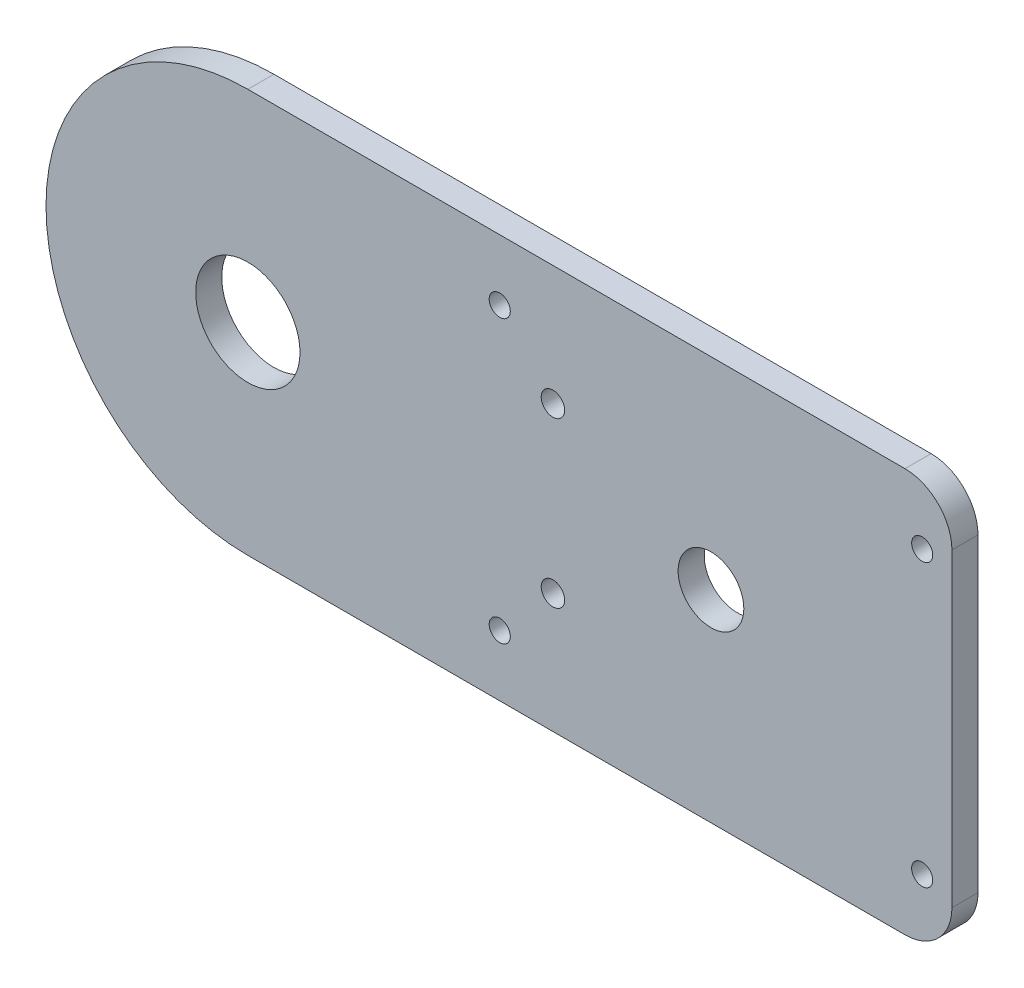
ISO-10303-21;
HEADER;
FILE_DESCRIPTION(('STEP AP214'),'2;1');
FILE_NAME('part.step','',(''),(''),'','','');
FILE_SCHEMA(('AUTOMOTIVE_DESIGN { 1 0 10303 214 1 1 1 1 }'));
ENDSEC;
DATA;
#1=APPLICATION_CONTEXT('core data for automotive mechanical design processes');
#2=APPLICATION_PROTOCOL_DEFINITION('international standard','automotive_design',2000,#1);
#3=PRODUCT_CONTEXT('',#1,'mechanical');
#4=PRODUCT('Part','Part','',(#3));
#5=PRODUCT_RELATED_PRODUCT_CATEGORY('part','',(#4));
#6=PRODUCT_DEFINITION_FORMATION('','',#4);
#7=PRODUCT_DEFINITION_CONTEXT('part definition',#1,'design');
#8=PRODUCT_DEFINITION('design','',#6,#7);
#9=PRODUCT_DEFINITION_SHAPE('','',#8);
#10=(LENGTH_UNIT() NAMED_UNIT(*) SI_UNIT(.MILLI.,.METRE.));
#11=(NAMED_UNIT(*) PLANE_ANGLE_UNIT() SI_UNIT($,.RADIAN.));
#12=(NAMED_UNIT(*) SI_UNIT($,.STERADIAN.) SOLID_ANGLE_UNIT());
#13=UNCERTAINTY_MEASURE_WITH_UNIT(LENGTH_MEASURE(1.E-05),#10,'distance_accuracy_value','');
#14=(GEOMETRIC_REPRESENTATION_CONTEXT(3) GLOBAL_UNCERTAINTY_ASSIGNED_CONTEXT((#13)) GLOBAL_UNIT_ASSIGNED_CONTEXT((#10,
#11,#12)) REPRESENTATION_CONTEXT('',''));
#15=CARTESIAN_POINT('',(0.,0.,0.));
#16=DIRECTION('',(0.,0.,1.));
#17=DIRECTION('',(1.,0.,0.));
#18=AXIS2_PLACEMENT_3D('',#15,#16,#17);
#19=CARTESIAN_POINT('',(-65.,0.,5.55625));
#20=DIRECTION('',(0.,0.,1.));
#21=DIRECTION('',(1.,0.,0.));
#22=AXIS2_PLACEMENT_3D('',#19,#20,#21);
#23=PLANE('',#22);
#24=CARTESIAN_POINT('',(0.,17.5,5.55625));
#25=DIRECTION('',(0.,0.,1.));
#26=DIRECTION('',(1.,0.,0.));
#27=AXIS2_PLACEMENT_3D('',#24,#25,#26);
#28=CIRCLE('',#27,2.5);
#29=CARTESIAN_POINT('',(2.49999999999999,17.5,5.55625));
#30=VERTEX_POINT('',#29);
#31=EDGE_CURVE('E144',#30,#30,#28,.T.);
#32=ORIENTED_EDGE('',*,*,#31,.F.);
#33=EDGE_LOOP('',(#32));
#34=FACE_BOUND('',#33,.T.);
#35=CARTESIAN_POINT('',(0.,-17.5,5.55625));
#36=DIRECTION('',(0.,0.,1.));
#37=DIRECTION('',(1.,0.,0.));
#38=AXIS2_PLACEMENT_3D('',#35,#36,#37);
#39=CIRCLE('',#38,2.5);
#40=CARTESIAN_POINT('',(2.5,-17.5,5.55625));
#41=VERTEX_POINT('',#40);
#42=EDGE_CURVE('E150',#41,#41,#39,.T.);
#43=ORIENTED_EDGE('',*,*,#42,.F.);
#44=EDGE_LOOP('',(#43));
#45=FACE_BOUND('',#44,.T.);
#46=CARTESIAN_POINT('',(78.66639768,-30.,5.55625));
#47=DIRECTION('',(0.,0.,1.));
#48=DIRECTION('',(1.,0.,0.));
#49=AXIS2_PLACEMENT_3D('',#46,#47,#48);
#50=CIRCLE('',#49,2.25000000101589);
#51=CARTESIAN_POINT('',(80.9163976810159,-30.,5.55625));
#52=VERTEX_POINT('',#51);
#53=EDGE_CURVE('E160',#52,#52,#50,.T.);
#54=ORIENTED_EDGE('',*,*,#53,.F.);
#55=EDGE_LOOP('',(#54));
#56=FACE_BOUND('',#55,.T.);
#57=CARTESIAN_POINT('',(-11.33360232,30.,5.55625));
#58=DIRECTION('',(0.,0.,1.));
#59=DIRECTION('',(1.,0.,0.));
#60=AXIS2_PLACEMENT_3D('',#57,#58,#59);
#61=CIRCLE('',#60,2.25000000101589);
#62=CARTESIAN_POINT('',(-9.0836023189841,30.,5.55625));
#63=VERTEX_POINT('',#62);
#64=EDGE_CURVE('E159',#63,#63,#61,.T.);
#65=ORIENTED_EDGE('',*,*,#64,.F.);
#66=EDGE_LOOP('',(#65));
#67=FACE_BOUND('',#66,.T.);
#68=CARTESIAN_POINT('',(-11.33360232,-30.,5.55625));
#69=DIRECTION('',(0.,0.,1.));
#70=DIRECTION('',(1.,0.,0.));
#71=AXIS2_PLACEMENT_3D('',#68,#69,#70);
#72=CIRCLE('',#71,2.25000000101589);
#73=CARTESIAN_POINT('',(-9.0836023189841,-30.,5.55625));
#74=VERTEX_POINT('',#73);
#75=EDGE_CURVE('E148',#74,#74,#72,.T.);
#76=ORIENTED_EDGE('',*,*,#75,.F.);
#77=EDGE_LOOP('',(#76));
#78=FACE_BOUND('',#77,.T.);
#79=CARTESIAN_POINT('',(78.66639768,30.,5.55625));
#80=DIRECTION('',(0.,0.,1.));
#81=DIRECTION('',(1.,0.,0.));
#82=AXIS2_PLACEMENT_3D('',#79,#80,#81);
#83=CIRCLE('',#82,2.25000000101589);
#84=CARTESIAN_POINT('',(80.9163976810159,30.,5.55625));
#85=VERTEX_POINT('',#84);
#86=EDGE_CURVE('E133',#85,#85,#83,.T.);
#87=ORIENTED_EDGE('',*,*,#86,.F.);
#88=EDGE_LOOP('',(#87));
#89=FACE_BOUND('',#88,.T.);
#90=CARTESIAN_POINT('',(33.66639768,0.,5.55625));
#91=DIRECTION('',(0.,0.,1.));
#92=DIRECTION('',(1.,0.,0.));
#93=AXIS2_PLACEMENT_3D('',#90,#91,#92);
#94=CIRCLE('',#93,7.00000000101591);
#95=CARTESIAN_POINT('',(40.6663976810159,0.,5.55625));
#96=VERTEX_POINT('',#95);
#97=EDGE_CURVE('E141',#96,#96,#94,.T.);
#98=ORIENTED_EDGE('',*,*,#97,.F.);
#99=EDGE_LOOP('',(#98));
#100=FACE_BOUND('',#99,.T.);
#101=DIRECTION('',(1.,0.,0.));
#102=VECTOR('',#101,1.);
#103=CARTESIAN_POINT('',(85.,-43.,5.55625));
#104=LINE('',#103,#102);
#105=CARTESIAN_POINT('',(-65.,-43.,5.55625));
#106=VERTEX_POINT('',#105);
#107=CARTESIAN_POINT('',(75.,-43.,5.55625));
#108=VERTEX_POINT('',#107);
#109=EDGE_CURVE('E91',#106,#108,#104,.T.);
#110=ORIENTED_EDGE('',*,*,#109,.T.);
#111=CARTESIAN_POINT('',(75.,-33.,5.55625));
#112=DIRECTION('',(0.,0.,1.));
#113=DIRECTION('',(1.,0.,0.));
#114=AXIS2_PLACEMENT_3D('',#111,#112,#113);
#115=CIRCLE('',#114,10.);
#116=CARTESIAN_POINT('',(85.,-33.,5.55625));
#117=VERTEX_POINT('',#116);
#118=EDGE_CURVE('E45',#108,#117,#115,.T.);
#119=ORIENTED_EDGE('',*,*,#118,.T.);
#120=DIRECTION('',(0.,1.,0.));
#121=VECTOR('',#120,1.);
#122=CARTESIAN_POINT('',(85.,43.,5.55625));
#123=LINE('',#122,#121);
#124=CARTESIAN_POINT('',(85.,33.,5.55625));
#125=VERTEX_POINT('',#124);
#126=EDGE_CURVE('E98',#117,#125,#123,.T.);
#127=ORIENTED_EDGE('',*,*,#126,.T.);
#128=CARTESIAN_POINT('',(75.,33.,5.55625));
#129=DIRECTION('',(0.,0.,1.));
#130=DIRECTION('',(1.,0.,0.));
#131=AXIS2_PLACEMENT_3D('',#128,#129,#130);
#132=CIRCLE('',#131,10.);
#133=CARTESIAN_POINT('',(75.,43.,5.55625));
#134=VERTEX_POINT('',#133);
#135=EDGE_CURVE('E53',#125,#134,#132,.T.);
#136=ORIENTED_EDGE('',*,*,#135,.T.);
#137=DIRECTION('',(-1.,0.,0.));
#138=VECTOR('',#137,1.);
#139=CARTESIAN_POINT('',(-65.,43.,5.55625));
#140=LINE('',#139,#138);
#141=CARTESIAN_POINT('',(-65.,43.,5.55625));
#142=VERTEX_POINT('',#141);
#143=EDGE_CURVE('E103',#134,#142,#140,.T.);
#144=ORIENTED_EDGE('',*,*,#143,.T.);
#145=CARTESIAN_POINT('',(-65.,0.,5.55625));
#146=DIRECTION('',(0.,0.,1.));
#147=DIRECTION('',(1.,0.,0.));
#148=AXIS2_PLACEMENT_3D('',#145,#146,#147);
#149=CIRCLE('',#148,43.);
#150=EDGE_CURVE('E99',#142,#106,#149,.T.);
#151=ORIENTED_EDGE('',*,*,#150,.T.);
#152=EDGE_LOOP('',(#110,#119,#127,#136,#144,#151));
#153=FACE_BOUND('',#152,.T.);
#154=CARTESIAN_POINT('',(-65.,0.,5.55625));
#155=DIRECTION('',(0.,0.,1.));
#156=DIRECTION('',(1.,0.,0.));
#157=AXIS2_PLACEMENT_3D('',#154,#155,#156);
#158=CIRCLE('',#157,11.1125);
#159=CARTESIAN_POINT('',(-53.8875,0.,5.55625));
#160=VERTEX_POINT('',#159);
#161=EDGE_CURVE('E173',#160,#160,#158,.T.);
#162=ORIENTED_EDGE('',*,*,#161,.F.);
#163=EDGE_LOOP('',(#162));
#164=FACE_BOUND('',#163,.T.);
#165=ADVANCED_FACE('F36',(#34,#45,#56,#67,#78,#89,#100,#153,#164),#23,.T.);
#166=CARTESIAN_POINT('',(-65.,0.,0.));
#167=DIRECTION('',(0.,0.,1.));
#168=DIRECTION('',(1.,0.,0.));
#169=AXIS2_PLACEMENT_3D('',#166,#167,#168);
#170=PLANE('',#169);
#171=CARTESIAN_POINT('',(0.,17.5,0.));
#172=DIRECTION('',(0.,0.,1.));
#173=DIRECTION('',(1.,0.,0.));
#174=AXIS2_PLACEMENT_3D('',#171,#172,#173);
#175=CIRCLE('',#174,2.5);
#176=CARTESIAN_POINT('',(2.49999999999999,17.5,0.));
#177=VERTEX_POINT('',#176);
#178=EDGE_CURVE('E40',#177,#177,#175,.T.);
#179=ORIENTED_EDGE('',*,*,#178,.T.);
#180=EDGE_LOOP('',(#179));
#181=FACE_BOUND('',#180,.T.);
#182=CARTESIAN_POINT('',(0.,-17.5,0.));
#183=DIRECTION('',(0.,0.,1.));
#184=DIRECTION('',(1.,0.,0.));
#185=AXIS2_PLACEMENT_3D('',#182,#183,#184);
#186=CIRCLE('',#185,2.5);
#187=CARTESIAN_POINT('',(2.5,-17.5,0.));
#188=VERTEX_POINT('',#187);
#189=EDGE_CURVE('E142',#188,#188,#186,.T.);
#190=ORIENTED_EDGE('',*,*,#189,.T.);
#191=EDGE_LOOP('',(#190));
#192=FACE_BOUND('',#191,.T.);
#193=CARTESIAN_POINT('',(78.66639768,-30.,0.));
#194=DIRECTION('',(0.,0.,1.));
#195=DIRECTION('',(1.,0.,0.));
#196=AXIS2_PLACEMENT_3D('',#193,#194,#195);
#197=CIRCLE('',#196,2.25000000101589);
#198=CARTESIAN_POINT('',(80.9163976810159,-30.,0.));
#199=VERTEX_POINT('',#198);
#200=EDGE_CURVE('E139',#199,#199,#197,.T.);
#201=ORIENTED_EDGE('',*,*,#200,.T.);
#202=EDGE_LOOP('',(#201));
#203=FACE_BOUND('',#202,.T.);
#204=CARTESIAN_POINT('',(-11.33360232,30.,0.));
#205=DIRECTION('',(0.,0.,1.));
#206=DIRECTION('',(1.,0.,0.));
#207=AXIS2_PLACEMENT_3D('',#204,#205,#206);
#208=CIRCLE('',#207,2.25000000101589);
#209=CARTESIAN_POINT('',(-9.0836023189841,30.,0.));
#210=VERTEX_POINT('',#209);
#211=EDGE_CURVE('E136',#210,#210,#208,.T.);
#212=ORIENTED_EDGE('',*,*,#211,.T.);
#213=EDGE_LOOP('',(#212));
#214=FACE_BOUND('',#213,.T.);
#215=CARTESIAN_POINT('',(-11.33360232,-30.,0.));
#216=DIRECTION('',(0.,0.,1.));
#217=DIRECTION('',(1.,0.,0.));
#218=AXIS2_PLACEMENT_3D('',#215,#216,#217);
#219=CIRCLE('',#218,2.25000000101589);
#220=CARTESIAN_POINT('',(-9.0836023189841,-30.,0.));
#221=VERTEX_POINT('',#220);
#222=EDGE_CURVE('E132',#221,#221,#219,.T.);
#223=ORIENTED_EDGE('',*,*,#222,.T.);
#224=EDGE_LOOP('',(#223));
#225=FACE_BOUND('',#224,.T.);
#226=CARTESIAN_POINT('',(78.66639768,30.,0.));
#227=DIRECTION('',(0.,0.,1.));
#228=DIRECTION('',(1.,0.,0.));
#229=AXIS2_PLACEMENT_3D('',#226,#227,#228);
#230=CIRCLE('',#229,2.25000000101589);
#231=CARTESIAN_POINT('',(80.9163976810159,30.,0.));
#232=VERTEX_POINT('',#231);
#233=EDGE_CURVE('E129',#232,#232,#230,.T.);
#234=ORIENTED_EDGE('',*,*,#233,.T.);
#235=EDGE_LOOP('',(#234));
#236=FACE_BOUND('',#235,.T.);
#237=CARTESIAN_POINT('',(33.66639768,0.,0.));
#238=DIRECTION('',(0.,0.,1.));
#239=DIRECTION('',(1.,0.,0.));
#240=AXIS2_PLACEMENT_3D('',#237,#238,#239);
#241=CIRCLE('',#240,7.00000000101591);
#242=CARTESIAN_POINT('',(40.6663976810159,0.,0.));
#243=VERTEX_POINT('',#242);
#244=EDGE_CURVE('E167',#243,#243,#241,.T.);
#245=ORIENTED_EDGE('',*,*,#244,.T.);
#246=EDGE_LOOP('',(#245));
#247=FACE_BOUND('',#246,.T.);
#248=DIRECTION('',(0.,1.,0.));
#249=VECTOR('',#248,1.);
#250=CARTESIAN_POINT('',(85.,43.,0.));
#251=LINE('',#250,#249);
#252=CARTESIAN_POINT('',(85.,-33.,0.));
#253=VERTEX_POINT('',#252);
#254=CARTESIAN_POINT('',(85.,33.,0.));
#255=VERTEX_POINT('',#254);
#256=EDGE_CURVE('E183',#253,#255,#251,.T.);
#257=ORIENTED_EDGE('',*,*,#256,.F.);
#258=CARTESIAN_POINT('',(75.,-33.,0.));
#259=DIRECTION('',(0.,0.,1.));
#260=DIRECTION('',(1.,0.,0.));
#261=AXIS2_PLACEMENT_3D('',#258,#259,#260);
#262=CIRCLE('',#261,10.);
#263=CARTESIAN_POINT('',(75.,-43.,0.));
#264=VERTEX_POINT('',#263);
#265=EDGE_CURVE('E124',#253,#264,#262,.F.);
#266=ORIENTED_EDGE('',*,*,#265,.T.);
#267=DIRECTION('',(1.,0.,0.));
#268=VECTOR('',#267,1.);
#269=CARTESIAN_POINT('',(85.,-43.,0.));
#270=LINE('',#269,#268);
#271=CARTESIAN_POINT('',(-65.,-43.,0.));
#272=VERTEX_POINT('',#271);
#273=EDGE_CURVE('E181',#272,#264,#270,.T.);
#274=ORIENTED_EDGE('',*,*,#273,.F.);
#275=CARTESIAN_POINT('',(-65.,0.,0.));
#276=DIRECTION('',(0.,0.,1.));
#277=DIRECTION('',(1.,0.,0.));
#278=AXIS2_PLACEMENT_3D('',#275,#276,#277);
#279=CIRCLE('',#278,43.);
#280=CARTESIAN_POINT('',(-65.,43.,0.));
#281=VERTEX_POINT('',#280);
#282=EDGE_CURVE('E111',#281,#272,#279,.T.);
#283=ORIENTED_EDGE('',*,*,#282,.F.);
#284=DIRECTION('',(-1.,0.,0.));
#285=VECTOR('',#284,1.);
#286=CARTESIAN_POINT('',(-65.,43.,0.));
#287=LINE('',#286,#285);
#288=CARTESIAN_POINT('',(75.,43.,0.));
#289=VERTEX_POINT('',#288);
#290=EDGE_CURVE('E107',#289,#281,#287,.T.);
#291=ORIENTED_EDGE('',*,*,#290,.F.);
#292=CARTESIAN_POINT('',(75.,33.,0.));
#293=DIRECTION('',(0.,0.,1.));
#294=DIRECTION('',(1.,0.,0.));
#295=AXIS2_PLACEMENT_3D('',#292,#293,#294);
#296=CIRCLE('',#295,10.);
#297=EDGE_CURVE('E122',#289,#255,#296,.F.);
#298=ORIENTED_EDGE('',*,*,#297,.T.);
#299=EDGE_LOOP('',(#257,#266,#274,#283,#291,#298));
#300=FACE_BOUND('',#299,.T.);
#301=CARTESIAN_POINT('',(-65.,0.,0.));
#302=DIRECTION('',(0.,0.,1.));
#303=DIRECTION('',(1.,0.,0.));
#304=AXIS2_PLACEMENT_3D('',#301,#302,#303);
#305=CIRCLE('',#304,11.1125);
#306=CARTESIAN_POINT('',(-53.8875,0.,0.));
#307=VERTEX_POINT('',#306);
#308=EDGE_CURVE('E170',#307,#307,#305,.T.);
#309=ORIENTED_EDGE('',*,*,#308,.T.);
#310=EDGE_LOOP('',(#309));
#311=FACE_BOUND('',#310,.T.);
#312=ADVANCED_FACE('F191',(#181,#192,#203,#214,#225,#236,#247,#300,#311),#170,.F.);
#313=CARTESIAN_POINT('',(-65.,0.,5.55625));
#314=DIRECTION('',(0.,0.,-1.));
#315=DIRECTION('',(-1.,0.,0.));
#316=AXIS2_PLACEMENT_3D('',#313,#314,#315);
#317=CYLINDRICAL_SURFACE('',#316,43.);
#318=ORIENTED_EDGE('',*,*,#282,.T.);
#319=DIRECTION('',(0.,0.,-1.));
#320=VECTOR('',#319,1.);
#321=CARTESIAN_POINT('',(-65.,-43.,5.55625));
#322=LINE('',#321,#320);
#323=EDGE_CURVE('E95',#106,#272,#322,.T.);
#324=ORIENTED_EDGE('',*,*,#323,.F.);
#325=ORIENTED_EDGE('',*,*,#150,.F.);
#326=DIRECTION('',(0.,0.,-1.));
#327=VECTOR('',#326,1.);
#328=CARTESIAN_POINT('',(-65.,43.,5.55625));
#329=LINE('',#328,#327);
#330=EDGE_CURVE('E113',#142,#281,#329,.T.);
#331=ORIENTED_EDGE('',*,*,#330,.T.);
#332=EDGE_LOOP('',(#318,#324,#325,#331));
#333=FACE_BOUND('',#332,.T.);
#334=ADVANCED_FACE('F109',(#333),#317,.T.);
#335=CARTESIAN_POINT('',(85.,-43.,5.55625));
#336=DIRECTION('',(0.,1.,0.));
#337=DIRECTION('',(-1.,0.,0.));
#338=AXIS2_PLACEMENT_3D('',#335,#336,#337);
#339=PLANE('',#338);
#340=ORIENTED_EDGE('',*,*,#273,.T.);
#341=DIRECTION('',(0.,0.,-1.));
#342=VECTOR('',#341,1.);
#343=CARTESIAN_POINT('',(75.,-43.,5.55625));
#344=LINE('',#343,#342);
#345=EDGE_CURVE('E61',#264,#108,#344,.F.);
#346=ORIENTED_EDGE('',*,*,#345,.T.);
#347=ORIENTED_EDGE('',*,*,#109,.F.);
#348=ORIENTED_EDGE('',*,*,#323,.T.);
#349=EDGE_LOOP('',(#340,#346,#347,#348));
#350=FACE_BOUND('',#349,.T.);
#351=ADVANCED_FACE('F93',(#350),#339,.F.);
#352=CARTESIAN_POINT('',(85.,43.,5.55625));
#353=DIRECTION('',(-1.,0.,0.));
#354=DIRECTION('',(0.,0.,1.));
#355=AXIS2_PLACEMENT_3D('',#352,#353,#354);
#356=PLANE('',#355);
#357=ORIENTED_EDGE('',*,*,#126,.F.);
#358=DIRECTION('',(0.,0.,-1.));
#359=VECTOR('',#358,1.);
#360=CARTESIAN_POINT('',(85.,-33.,5.55625));
#361=LINE('',#360,#359);
#362=EDGE_CURVE('E115',#117,#253,#361,.T.);
#363=ORIENTED_EDGE('',*,*,#362,.T.);
#364=ORIENTED_EDGE('',*,*,#256,.T.);
#365=DIRECTION('',(0.,0.,-1.));
#366=VECTOR('',#365,1.);
#367=CARTESIAN_POINT('',(85.,33.,5.55625));
#368=LINE('',#367,#366);
#369=EDGE_CURVE('E112',#255,#125,#368,.F.);
#370=ORIENTED_EDGE('',*,*,#369,.T.);
#371=EDGE_LOOP('',(#357,#363,#364,#370));
#372=FACE_BOUND('',#371,.T.);
#373=ADVANCED_FACE('F198',(#372),#356,.F.);
#374=CARTESIAN_POINT('',(-65.,43.,5.55625));
#375=DIRECTION('',(0.,-1.,0.));
#376=DIRECTION('',(1.,0.,0.));
#377=AXIS2_PLACEMENT_3D('',#374,#375,#376);
#378=PLANE('',#377);
#379=ORIENTED_EDGE('',*,*,#143,.F.);
#380=DIRECTION('',(0.,0.,-1.));
#381=VECTOR('',#380,1.);
#382=CARTESIAN_POINT('',(75.,43.,5.55625));
#383=LINE('',#382,#381);
#384=EDGE_CURVE('E11',#134,#289,#383,.T.);
#385=ORIENTED_EDGE('',*,*,#384,.T.);
#386=ORIENTED_EDGE('',*,*,#290,.T.);
#387=ORIENTED_EDGE('',*,*,#330,.F.);
#388=EDGE_LOOP('',(#379,#385,#386,#387));
#389=FACE_BOUND('',#388,.T.);
#390=ADVANCED_FACE('F187',(#389),#378,.F.);
#391=CARTESIAN_POINT('',(-65.,0.,5.55625));
#392=DIRECTION('',(0.,0.,-1.));
#393=DIRECTION('',(-1.,0.,0.));
#394=AXIS2_PLACEMENT_3D('',#391,#392,#393);
#395=CYLINDRICAL_SURFACE('',#394,11.1125);
#396=ORIENTED_EDGE('',*,*,#161,.T.);
#397=EDGE_LOOP('',(#396));
#398=FACE_BOUND('',#397,.T.);
#399=ORIENTED_EDGE('',*,*,#308,.F.);
#400=EDGE_LOOP('',(#399));
#401=FACE_BOUND('',#400,.T.);
#402=ADVANCED_FACE('F221',(#398,#401),#395,.F.);
#403=CARTESIAN_POINT('',(33.66639768,0.,0.));
#404=DIRECTION('',(0.,0.,1.));
#405=DIRECTION('',(1.,0.,0.));
#406=AXIS2_PLACEMENT_3D('',#403,#404,#405);
#407=CYLINDRICAL_SURFACE('',#406,7.00000000101591);
#408=ORIENTED_EDGE('',*,*,#244,.F.);
#409=EDGE_LOOP('',(#408));
#410=FACE_BOUND('',#409,.T.);
#411=ORIENTED_EDGE('',*,*,#97,.T.);
#412=EDGE_LOOP('',(#411));
#413=FACE_BOUND('',#412,.T.);
#414=ADVANCED_FACE('F210',(#410,#413),#407,.F.);
#415=CARTESIAN_POINT('',(75.,-33.,5.55625));
#416=DIRECTION('',(0.,0.,-1.));
#417=DIRECTION('',(-1.,0.,0.));
#418=AXIS2_PLACEMENT_3D('',#415,#416,#417);
#419=CYLINDRICAL_SURFACE('',#418,10.);
#420=ORIENTED_EDGE('',*,*,#118,.F.);
#421=ORIENTED_EDGE('',*,*,#345,.F.);
#422=ORIENTED_EDGE('',*,*,#265,.F.);
#423=ORIENTED_EDGE('',*,*,#362,.F.);
#424=EDGE_LOOP('',(#420,#421,#422,#423));
#425=FACE_BOUND('',#424,.T.);
#426=ADVANCED_FACE('F194',(#425),#419,.T.);
#427=CARTESIAN_POINT('',(75.,33.,5.55625));
#428=DIRECTION('',(0.,0.,-1.));
#429=DIRECTION('',(-1.,0.,0.));
#430=AXIS2_PLACEMENT_3D('',#427,#428,#429);
#431=CYLINDRICAL_SURFACE('',#430,10.);
#432=ORIENTED_EDGE('',*,*,#135,.F.);
#433=ORIENTED_EDGE('',*,*,#369,.F.);
#434=ORIENTED_EDGE('',*,*,#297,.F.);
#435=ORIENTED_EDGE('',*,*,#384,.F.);
#436=EDGE_LOOP('',(#432,#433,#434,#435));
#437=FACE_BOUND('',#436,.T.);
#438=ADVANCED_FACE('F38',(#437),#431,.T.);
#439=CARTESIAN_POINT('',(78.66639768,30.,-0.79375));
#440=DIRECTION('',(0.,0.,1.));
#441=DIRECTION('',(1.,0.,0.));
#442=AXIS2_PLACEMENT_3D('',#439,#440,#441);
#443=CYLINDRICAL_SURFACE('',#442,2.25000000101589);
#444=ORIENTED_EDGE('',*,*,#86,.T.);
#445=EDGE_LOOP('',(#444));
#446=FACE_BOUND('',#445,.T.);
#447=ORIENTED_EDGE('',*,*,#233,.F.);
#448=EDGE_LOOP('',(#447));
#449=FACE_BOUND('',#448,.T.);
#450=ADVANCED_FACE('F202',(#446,#449),#443,.F.);
#451=CARTESIAN_POINT('',(-11.33360232,-30.,-0.79375));
#452=DIRECTION('',(0.,0.,1.));
#453=DIRECTION('',(1.,0.,0.));
#454=AXIS2_PLACEMENT_3D('',#451,#452,#453);
#455=CYLINDRICAL_SURFACE('',#454,2.25000000101589);
#456=ORIENTED_EDGE('',*,*,#75,.T.);
#457=EDGE_LOOP('',(#456));
#458=FACE_BOUND('',#457,.T.);
#459=ORIENTED_EDGE('',*,*,#222,.F.);
#460=EDGE_LOOP('',(#459));
#461=FACE_BOUND('',#460,.T.);
#462=ADVANCED_FACE('F207',(#458,#461),#455,.F.);
#463=CARTESIAN_POINT('',(-11.33360232,30.,-0.79375));
#464=DIRECTION('',(0.,0.,1.));
#465=DIRECTION('',(1.,0.,0.));
#466=AXIS2_PLACEMENT_3D('',#463,#464,#465);
#467=CYLINDRICAL_SURFACE('',#466,2.25000000101589);
#468=ORIENTED_EDGE('',*,*,#64,.T.);
#469=EDGE_LOOP('',(#468));
#470=FACE_BOUND('',#469,.T.);
#471=ORIENTED_EDGE('',*,*,#211,.F.);
#472=EDGE_LOOP('',(#471));
#473=FACE_BOUND('',#472,.T.);
#474=ADVANCED_FACE('F285',(#470,#473),#467,.F.);
#475=CARTESIAN_POINT('',(78.66639768,-30.,-0.79375));
#476=DIRECTION('',(0.,0.,1.));
#477=DIRECTION('',(1.,0.,0.));
#478=AXIS2_PLACEMENT_3D('',#475,#476,#477);
#479=CYLINDRICAL_SURFACE('',#478,2.25000000101589);
#480=ORIENTED_EDGE('',*,*,#53,.T.);
#481=EDGE_LOOP('',(#480));
#482=FACE_BOUND('',#481,.T.);
#483=ORIENTED_EDGE('',*,*,#200,.F.);
#484=EDGE_LOOP('',(#483));
#485=FACE_BOUND('',#484,.T.);
#486=ADVANCED_FACE('F296',(#482,#485),#479,.F.);
#487=CARTESIAN_POINT('',(0.,-17.5,-34.44375));
#488=DIRECTION('',(0.,0.,1.));
#489=DIRECTION('',(1.,0.,0.));
#490=AXIS2_PLACEMENT_3D('',#487,#488,#489);
#491=CYLINDRICAL_SURFACE('',#490,2.5);
#492=ORIENTED_EDGE('',*,*,#42,.T.);
#493=EDGE_LOOP('',(#492));
#494=FACE_BOUND('',#493,.T.);
#495=ORIENTED_EDGE('',*,*,#189,.F.);
#496=EDGE_LOOP('',(#495));
#497=FACE_BOUND('',#496,.T.);
#498=ADVANCED_FACE('F306',(#494,#497),#491,.F.);
#499=CARTESIAN_POINT('',(0.,17.5,-34.44375));
#500=DIRECTION('',(0.,0.,1.));
#501=DIRECTION('',(1.,0.,0.));
#502=AXIS2_PLACEMENT_3D('',#499,#500,#501);
#503=CYLINDRICAL_SURFACE('',#502,2.5);
#504=ORIENTED_EDGE('',*,*,#31,.T.);
#505=EDGE_LOOP('',(#504));
#506=FACE_BOUND('',#505,.T.);
#507=ORIENTED_EDGE('',*,*,#178,.F.);
#508=EDGE_LOOP('',(#507));
#509=FACE_BOUND('',#508,.T.);
#510=ADVANCED_FACE('F328',(#506,#509),#503,.F.);
#511=CLOSED_SHELL('',(#165,#312,#334,#351,#373,#390,#402,#414,#426,#438,#450,#462,#474,#486,
#498,#510));
#512=MANIFOLD_SOLID_BREP('B2',#511);
#513=ADVANCED_BREP_SHAPE_REPRESENTATION('',(#18,#512),#14);
#514=SHAPE_DEFINITION_REPRESENTATION(#9,#513);
ENDSEC;
END-ISO-10303-21;
